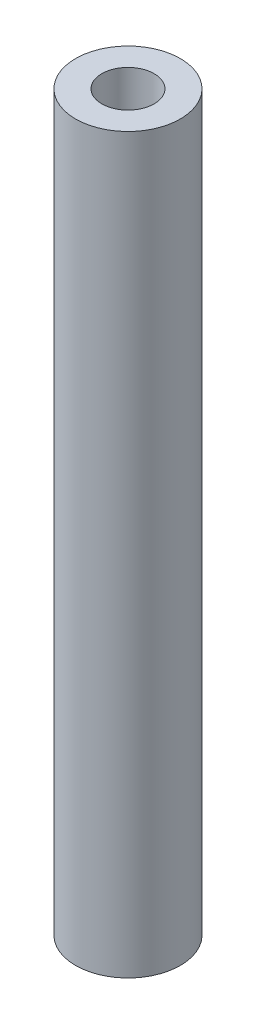
ISO-10303-21;
HEADER;
FILE_DESCRIPTION(('STEP AP214'),'2;1');
FILE_NAME('part.step','',(''),(''),'','','');
FILE_SCHEMA(('AUTOMOTIVE_DESIGN { 1 0 10303 214 1 1 1 1 }'));
ENDSEC;
DATA;
#1=APPLICATION_CONTEXT('core data for automotive mechanical design processes');
#2=APPLICATION_PROTOCOL_DEFINITION('international standard','automotive_design',2000,#1);
#3=PRODUCT_CONTEXT('',#1,'mechanical');
#4=PRODUCT('Part','Part','',(#3));
#5=PRODUCT_RELATED_PRODUCT_CATEGORY('part','',(#4));
#6=PRODUCT_DEFINITION_FORMATION('','',#4);
#7=PRODUCT_DEFINITION_CONTEXT('part definition',#1,'design');
#8=PRODUCT_DEFINITION('design','',#6,#7);
#9=PRODUCT_DEFINITION_SHAPE('','',#8);
#10=(LENGTH_UNIT() NAMED_UNIT(*) SI_UNIT(.MILLI.,.METRE.));
#11=(NAMED_UNIT(*) PLANE_ANGLE_UNIT() SI_UNIT($,.RADIAN.));
#12=(NAMED_UNIT(*) SI_UNIT($,.STERADIAN.) SOLID_ANGLE_UNIT());
#13=UNCERTAINTY_MEASURE_WITH_UNIT(LENGTH_MEASURE(1.E-05),#10,'distance_accuracy_value','');
#14=(GEOMETRIC_REPRESENTATION_CONTEXT(3) GLOBAL_UNCERTAINTY_ASSIGNED_CONTEXT((#13)) GLOBAL_UNIT_ASSIGNED_CONTEXT((#10,
#11,#12)) REPRESENTATION_CONTEXT('',''));
#15=CARTESIAN_POINT('',(0.,0.,0.));
#16=DIRECTION('',(0.,0.,1.));
#17=DIRECTION('',(1.,0.,0.));
#18=AXIS2_PLACEMENT_3D('',#15,#16,#17);
#19=CARTESIAN_POINT('',(0.,35.,0.));
#20=DIRECTION('',(0.,1.,0.));
#21=DIRECTION('',(0.,0.,1.));
#22=AXIS2_PLACEMENT_3D('',#19,#20,#21);
#23=PLANE('',#22);
#24=CARTESIAN_POINT('',(0.,35.,0.));
#25=DIRECTION('',(0.,1.,0.));
#26=DIRECTION('',(0.,0.,1.));
#27=AXIS2_PLACEMENT_3D('',#24,#25,#26);
#28=CIRCLE('',#27,2.5);
#29=CARTESIAN_POINT('',(0.,35.,2.5));
#30=VERTEX_POINT('',#29);
#31=EDGE_CURVE('E10',#30,#30,#28,.T.);
#32=ORIENTED_EDGE('',*,*,#31,.T.);
#33=EDGE_LOOP('',(#32));
#34=FACE_BOUND('',#33,.T.);
#35=CARTESIAN_POINT('',(0.,35.,0.));
#36=DIRECTION('',(0.,1.,0.));
#37=DIRECTION('',(0.,0.,1.));
#38=AXIS2_PLACEMENT_3D('',#35,#36,#37);
#39=CIRCLE('',#38,1.25);
#40=CARTESIAN_POINT('',(0.,35.,1.25));
#41=VERTEX_POINT('',#40);
#42=EDGE_CURVE('E42',#41,#41,#39,.T.);
#43=ORIENTED_EDGE('',*,*,#42,.F.);
#44=EDGE_LOOP('',(#43));
#45=FACE_BOUND('',#44,.T.);
#46=ADVANCED_FACE('F31',(#34,#45),#23,.T.);
#47=CARTESIAN_POINT('',(0.,0.,0.));
#48=DIRECTION('',(0.,1.,0.));
#49=DIRECTION('',(0.,0.,1.));
#50=AXIS2_PLACEMENT_3D('',#47,#48,#49);
#51=PLANE('',#50);
#52=CARTESIAN_POINT('',(0.,0.,0.));
#53=DIRECTION('',(0.,1.,0.));
#54=DIRECTION('',(0.,0.,1.));
#55=AXIS2_PLACEMENT_3D('',#52,#53,#54);
#56=CIRCLE('',#55,2.5);
#57=CARTESIAN_POINT('',(0.,0.,2.5));
#58=VERTEX_POINT('',#57);
#59=EDGE_CURVE('E35',#58,#58,#56,.T.);
#60=ORIENTED_EDGE('',*,*,#59,.F.);
#61=EDGE_LOOP('',(#60));
#62=FACE_BOUND('',#61,.T.);
#63=CARTESIAN_POINT('',(0.,0.,0.));
#64=DIRECTION('',(0.,1.,0.));
#65=DIRECTION('',(0.,0.,1.));
#66=AXIS2_PLACEMENT_3D('',#63,#64,#65);
#67=CIRCLE('',#66,1.25);
#68=CARTESIAN_POINT('',(0.,0.,1.25));
#69=VERTEX_POINT('',#68);
#70=EDGE_CURVE('E44',#69,#69,#67,.T.);
#71=ORIENTED_EDGE('',*,*,#70,.T.);
#72=EDGE_LOOP('',(#71));
#73=FACE_BOUND('',#72,.T.);
#74=ADVANCED_FACE('F54',(#62,#73),#51,.F.);
#75=CARTESIAN_POINT('',(0.,35.,0.));
#76=DIRECTION('',(0.,-1.,0.));
#77=DIRECTION('',(0.,0.,-1.));
#78=AXIS2_PLACEMENT_3D('',#75,#76,#77);
#79=CYLINDRICAL_SURFACE('',#78,2.5);
#80=ORIENTED_EDGE('',*,*,#31,.F.);
#81=EDGE_LOOP('',(#80));
#82=FACE_BOUND('',#81,.T.);
#83=ORIENTED_EDGE('',*,*,#59,.T.);
#84=EDGE_LOOP('',(#83));
#85=FACE_BOUND('',#84,.T.);
#86=ADVANCED_FACE('F33',(#82,#85),#79,.T.);
#87=CARTESIAN_POINT('',(0.,35.,0.));
#88=DIRECTION('',(0.,-1.,0.));
#89=DIRECTION('',(0.,0.,-1.));
#90=AXIS2_PLACEMENT_3D('',#87,#88,#89);
#91=CYLINDRICAL_SURFACE('',#90,1.25);
#92=ORIENTED_EDGE('',*,*,#42,.T.);
#93=EDGE_LOOP('',(#92));
#94=FACE_BOUND('',#93,.T.);
#95=ORIENTED_EDGE('',*,*,#70,.F.);
#96=EDGE_LOOP('',(#95));
#97=FACE_BOUND('',#96,.T.);
#98=ADVANCED_FACE('F50',(#94,#97),#91,.F.);
#99=CLOSED_SHELL('',(#46,#74,#86,#98));
#100=MANIFOLD_SOLID_BREP('B2',#99);
#101=ADVANCED_BREP_SHAPE_REPRESENTATION('',(#18,#100),#14);
#102=SHAPE_DEFINITION_REPRESENTATION(#9,#101);
ENDSEC;
END-ISO-10303-21;
